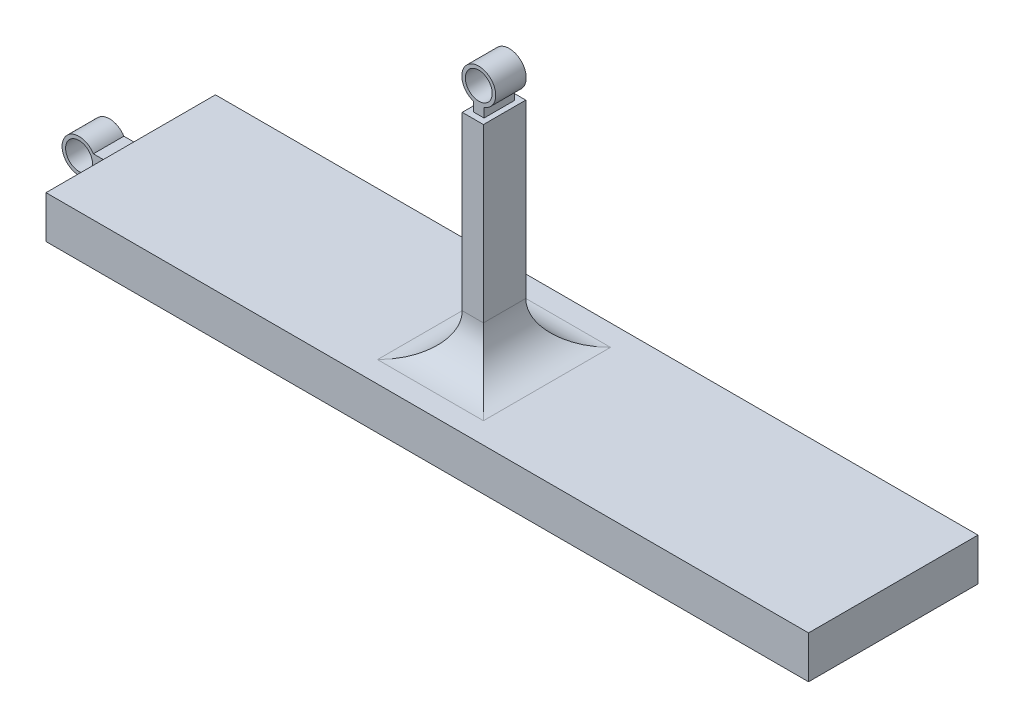
ISO-10303-21;
HEADER;
FILE_DESCRIPTION(('STEP AP214'),'2;1');
FILE_NAME('part.step','',(''),(''),'','','');
FILE_SCHEMA(('AUTOMOTIVE_DESIGN { 1 0 10303 214 1 1 1 1 }'));
ENDSEC;
DATA;
#1=APPLICATION_CONTEXT('core data for automotive mechanical design processes');
#2=APPLICATION_PROTOCOL_DEFINITION('international standard','automotive_design',2000,#1);
#3=PRODUCT_CONTEXT('',#1,'mechanical');
#4=PRODUCT('Part','Part','',(#3));
#5=PRODUCT_RELATED_PRODUCT_CATEGORY('part','',(#4));
#6=PRODUCT_DEFINITION_FORMATION('','',#4);
#7=PRODUCT_DEFINITION_CONTEXT('part definition',#1,'design');
#8=PRODUCT_DEFINITION('design','',#6,#7);
#9=PRODUCT_DEFINITION_SHAPE('','',#8);
#10=(LENGTH_UNIT() NAMED_UNIT(*) SI_UNIT(.MILLI.,.METRE.));
#11=(NAMED_UNIT(*) PLANE_ANGLE_UNIT() SI_UNIT($,.RADIAN.));
#12=(NAMED_UNIT(*) SI_UNIT($,.STERADIAN.) SOLID_ANGLE_UNIT());
#13=UNCERTAINTY_MEASURE_WITH_UNIT(LENGTH_MEASURE(1.E-05),#10,'distance_accuracy_value','');
#14=(GEOMETRIC_REPRESENTATION_CONTEXT(3) GLOBAL_UNCERTAINTY_ASSIGNED_CONTEXT((#13)) GLOBAL_UNIT_ASSIGNED_CONTEXT((#10,
#11,#12)) REPRESENTATION_CONTEXT('',''));
#15=CARTESIAN_POINT('',(0.,0.,0.));
#16=DIRECTION('',(0.,0.,1.));
#17=DIRECTION('',(1.,0.,0.));
#18=AXIS2_PLACEMENT_3D('',#15,#16,#17);
#19=CARTESIAN_POINT('',(361.815012660221,250.984199204464,125.));
#20=DIRECTION('',(0.,-1.,0.));
#21=DIRECTION('',(0.,0.,-1.));
#22=AXIS2_PLACEMENT_3D('',#19,#20,#21);
#23=PLANE('',#22);
#24=DIRECTION('',(-1.,0.,0.));
#25=VECTOR('',#24,1.);
#26=CARTESIAN_POINT('',(361.815012660221,250.984199204464,75.));
#27=LINE('',#26,#25);
#28=CARTESIAN_POINT('',(361.815012660221,250.984199204464,75.));
#29=VERTEX_POINT('',#28);
#30=CARTESIAN_POINT('',(336.815012660221,250.984199204464,75.));
#31=VERTEX_POINT('',#30);
#32=EDGE_CURVE('E209',#29,#31,#27,.T.);
#33=ORIENTED_EDGE('',*,*,#32,.T.);
#34=DIRECTION('',(0.,0.,-1.));
#35=VECTOR('',#34,1.);
#36=CARTESIAN_POINT('',(336.815012660221,250.984199204464,125.));
#37=LINE('',#36,#35);
#38=CARTESIAN_POINT('',(336.815012660221,250.984199204464,125.));
#39=VERTEX_POINT('',#38);
#40=EDGE_CURVE('E206',#39,#31,#37,.T.);
#41=ORIENTED_EDGE('',*,*,#40,.F.);
#42=DIRECTION('',(-1.,0.,0.));
#43=VECTOR('',#42,1.);
#44=CARTESIAN_POINT('',(361.815012660221,250.984199204464,125.));
#45=LINE('',#44,#43);
#46=CARTESIAN_POINT('',(361.815012660221,250.984199204464,125.));
#47=VERTEX_POINT('',#46);
#48=EDGE_CURVE('E200',#47,#39,#45,.T.);
#49=ORIENTED_EDGE('',*,*,#48,.F.);
#50=DIRECTION('',(0.,0.,-1.));
#51=VECTOR('',#50,1.);
#52=CARTESIAN_POINT('',(361.815012660221,250.984199204464,125.));
#53=LINE('',#52,#51);
#54=EDGE_CURVE('E215',#47,#29,#53,.T.);
#55=ORIENTED_EDGE('',*,*,#54,.T.);
#56=EDGE_LOOP('',(#33,#41,#49,#55));
#57=FACE_BOUND('',#56,.T.);
#58=DIRECTION('',(-1.,0.,0.));
#59=VECTOR('',#58,1.);
#60=CARTESIAN_POINT('',(0.,250.984199204464,82.));
#61=LINE('',#60,#59);
#62=CARTESIAN_POINT('',(355.564186933965,250.984199204464,82.));
#63=VERTEX_POINT('',#62);
#64=CARTESIAN_POINT('',(343.397322730233,250.984199204464,82.));
#65=VERTEX_POINT('',#64);
#66=EDGE_CURVE('E54',#63,#65,#61,.T.);
#67=ORIENTED_EDGE('',*,*,#66,.F.);
#68=DIRECTION('',(0.,0.,-1.));
#69=VECTOR('',#68,1.);
#70=CARTESIAN_POINT('',(355.564186933965,250.984199204464,118.));
#71=LINE('',#70,#69);
#72=CARTESIAN_POINT('',(355.564186933965,250.984199204464,118.));
#73=VERTEX_POINT('',#72);
#74=EDGE_CURVE('E616',#73,#63,#71,.T.);
#75=ORIENTED_EDGE('',*,*,#74,.F.);
#76=DIRECTION('',(-1.,0.,0.));
#77=VECTOR('',#76,1.);
#78=CARTESIAN_POINT('',(0.,250.984199204464,118.));
#79=LINE('',#78,#77);
#80=CARTESIAN_POINT('',(343.397322730233,250.984199204464,118.));
#81=VERTEX_POINT('',#80);
#82=EDGE_CURVE('E183',#73,#81,#79,.T.);
#83=ORIENTED_EDGE('',*,*,#82,.T.);
#84=DIRECTION('',(0.,0.,-1.));
#85=VECTOR('',#84,1.);
#86=CARTESIAN_POINT('',(343.397322730233,250.984199204464,118.));
#87=LINE('',#86,#85);
#88=EDGE_CURVE('E194',#81,#65,#87,.T.);
#89=ORIENTED_EDGE('',*,*,#88,.T.);
#90=EDGE_LOOP('',(#67,#75,#83,#89));
#91=FACE_BOUND('',#90,.T.);
#92=ADVANCED_FACE('F37',(#57,#91),#23,.F.);
#93=CARTESIAN_POINT('',(-79.4549873397789,-1.76580079553555,200.));
#94=DIRECTION('',(1.,0.,0.));
#95=DIRECTION('',(0.,0.,-1.));
#96=AXIS2_PLACEMENT_3D('',#93,#94,#95);
#97=PLANE('',#96);
#98=DIRECTION('',(0.,0.,-1.));
#99=VECTOR('',#98,1.);
#100=CARTESIAN_POINT('',(-79.4549873397789,-39.5392903074215,118.));
#101=LINE('',#100,#99);
#102=CARTESIAN_POINT('',(-79.4549873397789,-39.5392903074215,118.));
#103=VERTEX_POINT('',#102);
#104=CARTESIAN_POINT('',(-79.4549873397789,-39.5392903074215,82.));
#105=VERTEX_POINT('',#104);
#106=EDGE_CURVE('E247',#103,#105,#101,.T.);
#107=ORIENTED_EDGE('',*,*,#106,.T.);
#108=DIRECTION('',(0.,1.,0.));
#109=VECTOR('',#108,1.);
#110=CARTESIAN_POINT('',(-79.4549873397789,0.,82.));
#111=LINE('',#110,#109);
#112=CARTESIAN_POINT('',(-79.4549873397789,-16.1050713336061,82.));
#113=VERTEX_POINT('',#112);
#114=EDGE_CURVE('E242',#105,#113,#111,.T.);
#115=ORIENTED_EDGE('',*,*,#114,.T.);
#116=DIRECTION('',(0.,0.,-1.));
#117=VECTOR('',#116,1.);
#118=CARTESIAN_POINT('',(-79.4549873397789,-16.1050713336061,118.));
#119=LINE('',#118,#117);
#120=CARTESIAN_POINT('',(-79.4549873397789,-16.1050713336061,118.));
#121=VERTEX_POINT('',#120);
#122=EDGE_CURVE('E251',#121,#113,#119,.T.);
#123=ORIENTED_EDGE('',*,*,#122,.F.);
#124=DIRECTION('',(0.,1.,0.));
#125=VECTOR('',#124,1.);
#126=CARTESIAN_POINT('',(-79.4549873397789,0.,118.));
#127=LINE('',#126,#125);
#128=EDGE_CURVE('E228',#103,#121,#127,.T.);
#129=ORIENTED_EDGE('',*,*,#128,.F.);
#130=EDGE_LOOP('',(#107,#115,#123,#129));
#131=FACE_BOUND('',#130,.T.);
#132=DIRECTION('',(0.,-1.,0.));
#133=VECTOR('',#132,1.);
#134=CARTESIAN_POINT('',(-79.4549873397789,-1.76580079553555,0.));
#135=LINE('',#134,#133);
#136=CARTESIAN_POINT('',(-79.4549873397789,-1.76580079553555,0.));
#137=VERTEX_POINT('',#136);
#138=CARTESIAN_POINT('',(-79.4549873397789,-51.7658007955356,0.));
#139=VERTEX_POINT('',#138);
#140=EDGE_CURVE('E250',#137,#139,#135,.T.);
#141=ORIENTED_EDGE('',*,*,#140,.T.);
#142=DIRECTION('',(0.,0.,-1.));
#143=VECTOR('',#142,1.);
#144=CARTESIAN_POINT('',(-79.4549873397789,-51.7658007955356,200.));
#145=LINE('',#144,#143);
#146=CARTESIAN_POINT('',(-79.4549873397789,-51.7658007955356,200.));
#147=VERTEX_POINT('',#146);
#148=EDGE_CURVE('E282',#147,#139,#145,.T.);
#149=ORIENTED_EDGE('',*,*,#148,.F.);
#150=DIRECTION('',(0.,-1.,0.));
#151=VECTOR('',#150,1.);
#152=CARTESIAN_POINT('',(-79.4549873397789,-1.76580079553555,200.));
#153=LINE('',#152,#151);
#154=CARTESIAN_POINT('',(-79.4549873397789,-1.76580079553555,200.));
#155=VERTEX_POINT('',#154);
#156=EDGE_CURVE('E256',#155,#147,#153,.T.);
#157=ORIENTED_EDGE('',*,*,#156,.F.);
#158=DIRECTION('',(0.,0.,-1.));
#159=VECTOR('',#158,1.);
#160=CARTESIAN_POINT('',(-79.4549873397789,-1.76580079553555,200.));
#161=LINE('',#160,#159);
#162=EDGE_CURVE('E266',#155,#137,#161,.T.);
#163=ORIENTED_EDGE('',*,*,#162,.T.);
#164=EDGE_LOOP('',(#141,#149,#157,#163));
#165=FACE_BOUND('',#164,.T.);
#166=ADVANCED_FACE('F345',(#131,#165),#97,.F.);
#167=CARTESIAN_POINT('',(-79.4549873397789,-51.7658007955356,200.));
#168=DIRECTION('',(0.,1.,0.));
#169=DIRECTION('',(0.,0.,1.));
#170=AXIS2_PLACEMENT_3D('',#167,#168,#169);
#171=PLANE('',#170);
#172=DIRECTION('',(1.,0.,0.));
#173=VECTOR('',#172,1.);
#174=CARTESIAN_POINT('',(-79.4549873397789,-51.7658007955356,0.));
#175=LINE('',#174,#173);
#176=CARTESIAN_POINT('',(820.545012660221,-51.7658007955356,0.));
#177=VERTEX_POINT('',#176);
#178=EDGE_CURVE('E269',#139,#177,#175,.T.);
#179=ORIENTED_EDGE('',*,*,#178,.T.);
#180=DIRECTION('',(0.,0.,-1.));
#181=VECTOR('',#180,1.);
#182=CARTESIAN_POINT('',(820.545012660221,-51.7658007955356,200.));
#183=LINE('',#182,#181);
#184=CARTESIAN_POINT('',(820.545012660221,-51.7658007955356,200.));
#185=VERTEX_POINT('',#184);
#186=EDGE_CURVE('E279',#185,#177,#183,.T.);
#187=ORIENTED_EDGE('',*,*,#186,.F.);
#188=DIRECTION('',(1.,0.,0.));
#189=VECTOR('',#188,1.);
#190=CARTESIAN_POINT('',(-79.4549873397789,-51.7658007955356,200.));
#191=LINE('',#190,#189);
#192=EDGE_CURVE('E259',#147,#185,#191,.T.);
#193=ORIENTED_EDGE('',*,*,#192,.F.);
#194=ORIENTED_EDGE('',*,*,#148,.T.);
#195=EDGE_LOOP('',(#179,#187,#193,#194));
#196=FACE_BOUND('',#195,.T.);
#197=ADVANCED_FACE('F350',(#196),#171,.F.);
#198=CARTESIAN_POINT('',(820.545012660221,-51.7658007955356,200.));
#199=DIRECTION('',(-1.,0.,0.));
#200=DIRECTION('',(0.,0.,1.));
#201=AXIS2_PLACEMENT_3D('',#198,#199,#200);
#202=PLANE('',#201);
#203=DIRECTION('',(0.,1.,0.));
#204=VECTOR('',#203,1.);
#205=CARTESIAN_POINT('',(820.545012660221,-51.7658007955356,0.));
#206=LINE('',#205,#204);
#207=CARTESIAN_POINT('',(820.545012660221,-1.76580079553555,0.));
#208=VERTEX_POINT('',#207);
#209=EDGE_CURVE('E271',#177,#208,#206,.T.);
#210=ORIENTED_EDGE('',*,*,#209,.T.);
#211=DIRECTION('',(0.,0.,-1.));
#212=VECTOR('',#211,1.);
#213=CARTESIAN_POINT('',(820.545012660221,-1.76580079553555,200.));
#214=LINE('',#213,#212);
#215=CARTESIAN_POINT('',(820.545012660221,-1.76580079553555,200.));
#216=VERTEX_POINT('',#215);
#217=EDGE_CURVE('E276',#216,#208,#214,.T.);
#218=ORIENTED_EDGE('',*,*,#217,.F.);
#219=DIRECTION('',(0.,1.,0.));
#220=VECTOR('',#219,1.);
#221=CARTESIAN_POINT('',(820.545012660221,-51.7658007955356,200.));
#222=LINE('',#221,#220);
#223=EDGE_CURVE('E262',#185,#216,#222,.T.);
#224=ORIENTED_EDGE('',*,*,#223,.F.);
#225=ORIENTED_EDGE('',*,*,#186,.T.);
#226=EDGE_LOOP('',(#210,#218,#224,#225));
#227=FACE_BOUND('',#226,.T.);
#228=ADVANCED_FACE('F334',(#227),#202,.F.);
#229=CARTESIAN_POINT('',(-79.4549873397789,-1.76580079553555,200.));
#230=DIRECTION('',(0.,-1.,0.));
#231=DIRECTION('',(0.,0.,-1.));
#232=AXIS2_PLACEMENT_3D('',#229,#230,#231);
#233=PLANE('',#232);
#234=DIRECTION('',(1.,0.,0.));
#235=VECTOR('',#234,1.);
#236=CARTESIAN_POINT('',(-79.4549873397789,-1.76580079553555,175.));
#237=LINE('',#236,#235);
#238=CARTESIAN_POINT('',(411.815012660221,-1.76580079553555,175.));
#239=VERTEX_POINT('',#238);
#240=CARTESIAN_POINT('',(286.815012660221,-1.76580079553555,175.));
#241=VERTEX_POINT('',#240);
#242=EDGE_CURVE('E289',#239,#241,#237,.F.);
#243=ORIENTED_EDGE('',*,*,#242,.T.);
#244=DIRECTION('',(0.,0.,-1.));
#245=VECTOR('',#244,1.);
#246=CARTESIAN_POINT('',(286.815012660221,-1.76580079553555,75.));
#247=LINE('',#246,#245);
#248=CARTESIAN_POINT('',(286.815012660221,-1.76580079553555,25.));
#249=VERTEX_POINT('',#248);
#250=EDGE_CURVE('E291',#241,#249,#247,.T.);
#251=ORIENTED_EDGE('',*,*,#250,.T.);
#252=DIRECTION('',(1.,0.,0.));
#253=VECTOR('',#252,1.);
#254=CARTESIAN_POINT('',(361.815012660221,-1.76580079553555,25.));
#255=LINE('',#254,#253);
#256=CARTESIAN_POINT('',(411.815012660221,-1.76580079553555,25.));
#257=VERTEX_POINT('',#256);
#258=EDGE_CURVE('E285',#249,#257,#255,.T.);
#259=ORIENTED_EDGE('',*,*,#258,.T.);
#260=DIRECTION('',(0.,0.,-1.));
#261=VECTOR('',#260,1.);
#262=CARTESIAN_POINT('',(411.815012660221,-1.76580079553555,125.));
#263=LINE('',#262,#261);
#264=EDGE_CURVE('E287',#257,#239,#263,.F.);
#265=ORIENTED_EDGE('',*,*,#264,.T.);
#266=EDGE_LOOP('',(#243,#251,#259,#265));
#267=FACE_BOUND('',#266,.T.);
#268=DIRECTION('',(-1.,0.,0.));
#269=VECTOR('',#268,1.);
#270=CARTESIAN_POINT('',(-79.4549873397789,-1.76580079553555,0.));
#271=LINE('',#270,#269);
#272=EDGE_CURVE('E260',#208,#137,#271,.T.);
#273=ORIENTED_EDGE('',*,*,#272,.T.);
#274=ORIENTED_EDGE('',*,*,#162,.F.);
#275=DIRECTION('',(-1.,0.,0.));
#276=VECTOR('',#275,1.);
#277=CARTESIAN_POINT('',(-79.4549873397789,-1.76580079553555,200.));
#278=LINE('',#277,#276);
#279=EDGE_CURVE('E264',#216,#155,#278,.T.);
#280=ORIENTED_EDGE('',*,*,#279,.F.);
#281=ORIENTED_EDGE('',*,*,#217,.T.);
#282=EDGE_LOOP('',(#273,#274,#280,#281));
#283=FACE_BOUND('',#282,.T.);
#284=ADVANCED_FACE('F330',(#267,#283),#233,.F.);
#285=CARTESIAN_POINT('',(0.,0.,200.));
#286=DIRECTION('',(0.,0.,1.));
#287=DIRECTION('',(1.,0.,0.));
#288=AXIS2_PLACEMENT_3D('',#285,#286,#287);
#289=PLANE('',#288);
#290=ORIENTED_EDGE('',*,*,#156,.T.);
#291=ORIENTED_EDGE('',*,*,#192,.T.);
#292=ORIENTED_EDGE('',*,*,#223,.T.);
#293=ORIENTED_EDGE('',*,*,#279,.T.);
#294=EDGE_LOOP('',(#290,#291,#292,#293));
#295=FACE_BOUND('',#294,.T.);
#296=ADVANCED_FACE('F333',(#295),#289,.T.);
#297=CARTESIAN_POINT('',(0.,0.,0.));
#298=DIRECTION('',(0.,0.,1.));
#299=DIRECTION('',(1.,0.,0.));
#300=AXIS2_PLACEMENT_3D('',#297,#298,#299);
#301=PLANE('',#300);
#302=ORIENTED_EDGE('',*,*,#140,.F.);
#303=ORIENTED_EDGE('',*,*,#272,.F.);
#304=ORIENTED_EDGE('',*,*,#209,.F.);
#305=ORIENTED_EDGE('',*,*,#178,.F.);
#306=EDGE_LOOP('',(#302,#303,#304,#305));
#307=FACE_BOUND('',#306,.T.);
#308=ADVANCED_FACE('F347',(#307),#301,.F.);
#309=CARTESIAN_POINT('',(0.,-39.5392903074215,118.));
#310=DIRECTION('',(0.,-1.,0.));
#311=DIRECTION('',(0.,0.,-1.));
#312=AXIS2_PLACEMENT_3D('',#309,#310,#311);
#313=PLANE('',#312);
#314=DIRECTION('',(-1.,0.,0.));
#315=VECTOR('',#314,1.);
#316=CARTESIAN_POINT('',(0.,-39.5392903074215,82.));
#317=LINE('',#316,#315);
#318=CARTESIAN_POINT('',(-107.065446550992,-39.5392903074215,82.));
#319=VERTEX_POINT('',#318);
#320=EDGE_CURVE('E218',#105,#319,#317,.T.);
#321=ORIENTED_EDGE('',*,*,#320,.F.);
#322=ORIENTED_EDGE('',*,*,#106,.F.);
#323=DIRECTION('',(-1.,0.,0.));
#324=VECTOR('',#323,1.);
#325=CARTESIAN_POINT('',(0.,-39.5392903074215,118.));
#326=LINE('',#325,#324);
#327=CARTESIAN_POINT('',(-107.065446550992,-39.5392903074215,118.));
#328=VERTEX_POINT('',#327);
#329=EDGE_CURVE('E219',#103,#328,#326,.T.);
#330=ORIENTED_EDGE('',*,*,#329,.T.);
#331=DIRECTION('',(0.,0.,-1.));
#332=VECTOR('',#331,1.);
#333=CARTESIAN_POINT('',(-107.065446550992,-39.5392903074215,118.));
#334=LINE('',#333,#332);
#335=EDGE_CURVE('E233',#328,#319,#334,.T.);
#336=ORIENTED_EDGE('',*,*,#335,.T.);
#337=EDGE_LOOP('',(#321,#322,#330,#336));
#338=FACE_BOUND('',#337,.T.);
#339=ADVANCED_FACE('F391',(#338),#313,.T.);
#340=CARTESIAN_POINT('',(0.,-16.1050713336061,118.));
#341=DIRECTION('',(0.,-1.,0.));
#342=DIRECTION('',(0.,0.,-1.));
#343=AXIS2_PLACEMENT_3D('',#340,#341,#342);
#344=PLANE('',#343);
#345=DIRECTION('',(-1.,0.,0.));
#346=VECTOR('',#345,1.);
#347=CARTESIAN_POINT('',(0.,-16.1050713336061,82.));
#348=LINE('',#347,#346);
#349=CARTESIAN_POINT('',(-105.533142069846,-16.1050713336061,82.));
#350=VERTEX_POINT('',#349);
#351=EDGE_CURVE('E239',#113,#350,#348,.T.);
#352=ORIENTED_EDGE('',*,*,#351,.T.);
#353=DIRECTION('',(0.,0.,-1.));
#354=VECTOR('',#353,1.);
#355=CARTESIAN_POINT('',(-105.533142069846,-16.1050713336061,118.));
#356=LINE('',#355,#354);
#357=CARTESIAN_POINT('',(-105.533142069846,-16.1050713336061,118.));
#358=VERTEX_POINT('',#357);
#359=EDGE_CURVE('E253',#358,#350,#356,.T.);
#360=ORIENTED_EDGE('',*,*,#359,.F.);
#361=DIRECTION('',(-1.,0.,0.));
#362=VECTOR('',#361,1.);
#363=CARTESIAN_POINT('',(0.,-16.1050713336061,118.));
#364=LINE('',#363,#362);
#365=EDGE_CURVE('E226',#121,#358,#364,.T.);
#366=ORIENTED_EDGE('',*,*,#365,.F.);
#367=ORIENTED_EDGE('',*,*,#122,.T.);
#368=EDGE_LOOP('',(#352,#360,#366,#367));
#369=FACE_BOUND('',#368,.T.);
#370=ADVANCED_FACE('F388',(#369),#344,.F.);
#371=CARTESIAN_POINT('',(-122.454987339779,-26.7658007955356,118.));
#372=DIRECTION('',(0.,0.,-1.));
#373=DIRECTION('',(-1.,0.,0.));
#374=AXIS2_PLACEMENT_3D('',#371,#372,#373);
#375=CYLINDRICAL_SURFACE('',#374,20.);
#376=CARTESIAN_POINT('',(-122.454987339779,-26.7658007955356,82.));
#377=DIRECTION('',(0.,0.,-1.));
#378=DIRECTION('',(-1.,0.,0.));
#379=AXIS2_PLACEMENT_3D('',#376,#377,#378);
#380=CIRCLE('',#379,20.);
#381=EDGE_CURVE('E236',#319,#350,#380,.T.);
#382=ORIENTED_EDGE('',*,*,#381,.F.);
#383=ORIENTED_EDGE('',*,*,#335,.F.);
#384=CARTESIAN_POINT('',(-122.454987339779,-26.7658007955356,118.));
#385=DIRECTION('',(0.,0.,-1.));
#386=DIRECTION('',(-1.,0.,0.));
#387=AXIS2_PLACEMENT_3D('',#384,#385,#386);
#388=CIRCLE('',#387,20.);
#389=EDGE_CURVE('E222',#328,#358,#388,.T.);
#390=ORIENTED_EDGE('',*,*,#389,.T.);
#391=ORIENTED_EDGE('',*,*,#359,.T.);
#392=EDGE_LOOP('',(#382,#383,#390,#391));
#393=FACE_BOUND('',#392,.T.);
#394=ADVANCED_FACE('F386',(#393),#375,.T.);
#395=CARTESIAN_POINT('',(-122.454987339779,-26.7658007955356,118.));
#396=DIRECTION('',(0.,0.,-1.));
#397=DIRECTION('',(-1.,0.,0.));
#398=AXIS2_PLACEMENT_3D('',#395,#396,#397);
#399=CYLINDRICAL_SURFACE('',#398,15.875);
#400=CARTESIAN_POINT('',(-122.454987339779,-26.7658007955356,118.));
#401=DIRECTION('',(0.,0.,-1.));
#402=DIRECTION('',(-1.,0.,0.));
#403=AXIS2_PLACEMENT_3D('',#400,#401,#402);
#404=CIRCLE('',#403,15.875);
#405=CARTESIAN_POINT('',(-138.329987339779,-26.7658007955356,118.));
#406=VERTEX_POINT('',#405);
#407=EDGE_CURVE('E230',#406,#406,#404,.T.);
#408=ORIENTED_EDGE('',*,*,#407,.F.);
#409=EDGE_LOOP('',(#408));
#410=FACE_BOUND('',#409,.T.);
#411=CARTESIAN_POINT('',(-122.454987339779,-26.7658007955356,82.));
#412=DIRECTION('',(0.,0.,-1.));
#413=DIRECTION('',(-1.,0.,0.));
#414=AXIS2_PLACEMENT_3D('',#411,#412,#413);
#415=CIRCLE('',#414,15.875);
#416=CARTESIAN_POINT('',(-138.329987339779,-26.7658007955356,82.));
#417=VERTEX_POINT('',#416);
#418=EDGE_CURVE('E223',#417,#417,#415,.T.);
#419=ORIENTED_EDGE('',*,*,#418,.T.);
#420=EDGE_LOOP('',(#419));
#421=FACE_BOUND('',#420,.T.);
#422=ADVANCED_FACE('F379',(#410,#421),#399,.F.);
#423=CARTESIAN_POINT('',(0.,0.,118.));
#424=DIRECTION('',(0.,0.,-1.));
#425=DIRECTION('',(-1.,0.,0.));
#426=AXIS2_PLACEMENT_3D('',#423,#424,#425);
#427=PLANE('',#426);
#428=ORIENTED_EDGE('',*,*,#329,.F.);
#429=ORIENTED_EDGE('',*,*,#128,.T.);
#430=ORIENTED_EDGE('',*,*,#365,.T.);
#431=ORIENTED_EDGE('',*,*,#389,.F.);
#432=EDGE_LOOP('',(#428,#429,#430,#431));
#433=FACE_BOUND('',#432,.T.);
#434=ORIENTED_EDGE('',*,*,#407,.T.);
#435=EDGE_LOOP('',(#434));
#436=FACE_BOUND('',#435,.T.);
#437=ADVANCED_FACE('F376',(#433,#436),#427,.F.);
#438=CARTESIAN_POINT('',(0.,0.,82.));
#439=DIRECTION('',(0.,0.,-1.));
#440=DIRECTION('',(-1.,0.,0.));
#441=AXIS2_PLACEMENT_3D('',#438,#439,#440);
#442=PLANE('',#441);
#443=ORIENTED_EDGE('',*,*,#320,.T.);
#444=ORIENTED_EDGE('',*,*,#381,.T.);
#445=ORIENTED_EDGE('',*,*,#351,.F.);
#446=ORIENTED_EDGE('',*,*,#114,.F.);
#447=EDGE_LOOP('',(#443,#444,#445,#446));
#448=FACE_BOUND('',#447,.T.);
#449=ORIENTED_EDGE('',*,*,#418,.F.);
#450=EDGE_LOOP('',(#449));
#451=FACE_BOUND('',#450,.T.);
#452=ADVANCED_FACE('F375',(#448,#451),#442,.T.);
#453=CARTESIAN_POINT('',(361.815012660221,-1.76580079553555,125.));
#454=DIRECTION('',(-1.,0.,0.));
#455=DIRECTION('',(0.,0.,1.));
#456=AXIS2_PLACEMENT_3D('',#453,#454,#455);
#457=PLANE('',#456);
#458=DIRECTION('',(0.,1.,0.));
#459=VECTOR('',#458,1.);
#460=CARTESIAN_POINT('',(361.815012660221,-1.76580079553555,125.));
#461=LINE('',#460,#459);
#462=CARTESIAN_POINT('',(361.815012660221,48.2341992044645,125.));
#463=VERTEX_POINT('',#462);
#464=EDGE_CURVE('E198',#463,#47,#461,.T.);
#465=ORIENTED_EDGE('',*,*,#464,.F.);
#466=DIRECTION('',(0.,0.,-1.));
#467=VECTOR('',#466,1.);
#468=CARTESIAN_POINT('',(361.815012660221,48.2341992044645,75.));
#469=LINE('',#468,#467);
#470=CARTESIAN_POINT('',(361.815012660221,48.2341992044645,75.));
#471=VERTEX_POINT('',#470);
#472=EDGE_CURVE('E46',#463,#471,#469,.T.);
#473=ORIENTED_EDGE('',*,*,#472,.T.);
#474=DIRECTION('',(0.,1.,0.));
#475=VECTOR('',#474,1.);
#476=CARTESIAN_POINT('',(361.815012660221,-1.76580079553555,75.));
#477=LINE('',#476,#475);
#478=EDGE_CURVE('E207',#471,#29,#477,.T.);
#479=ORIENTED_EDGE('',*,*,#478,.T.);
#480=ORIENTED_EDGE('',*,*,#54,.F.);
#481=EDGE_LOOP('',(#465,#473,#479,#480));
#482=FACE_BOUND('',#481,.T.);
#483=ADVANCED_FACE('F372',(#482),#457,.F.);
#484=CARTESIAN_POINT('',(336.815012660221,-1.76580079553555,125.));
#485=DIRECTION('',(1.,0.,0.));
#486=DIRECTION('',(0.,1.,0.));
#487=AXIS2_PLACEMENT_3D('',#484,#485,#486);
#488=PLANE('',#487);
#489=DIRECTION('',(0.,-1.,0.));
#490=VECTOR('',#489,1.);
#491=CARTESIAN_POINT('',(336.815012660221,-1.76580079553555,75.));
#492=LINE('',#491,#490);
#493=CARTESIAN_POINT('',(336.815012660221,48.2341992044645,75.));
#494=VERTEX_POINT('',#493);
#495=EDGE_CURVE('E201',#31,#494,#492,.T.);
#496=ORIENTED_EDGE('',*,*,#495,.T.);
#497=DIRECTION('',(0.,0.,-1.));
#498=VECTOR('',#497,1.);
#499=CARTESIAN_POINT('',(336.815012660221,48.2341992044644,125.));
#500=LINE('',#499,#498);
#501=CARTESIAN_POINT('',(336.815012660221,48.2341992044645,125.));
#502=VERTEX_POINT('',#501);
#503=EDGE_CURVE('E294',#494,#502,#500,.F.);
#504=ORIENTED_EDGE('',*,*,#503,.T.);
#505=DIRECTION('',(0.,-1.,0.));
#506=VECTOR('',#505,1.);
#507=CARTESIAN_POINT('',(336.815012660221,-1.76580079553555,125.));
#508=LINE('',#507,#506);
#509=EDGE_CURVE('E203',#39,#502,#508,.T.);
#510=ORIENTED_EDGE('',*,*,#509,.F.);
#511=ORIENTED_EDGE('',*,*,#40,.T.);
#512=EDGE_LOOP('',(#496,#504,#510,#511));
#513=FACE_BOUND('',#512,.T.);
#514=ADVANCED_FACE('F323',(#513),#488,.F.);
#515=CARTESIAN_POINT('',(0.,0.,125.));
#516=DIRECTION('',(0.,0.,1.));
#517=DIRECTION('',(1.,0.,0.));
#518=AXIS2_PLACEMENT_3D('',#515,#516,#517);
#519=PLANE('',#518);
#520=ORIENTED_EDGE('',*,*,#509,.T.);
#521=DIRECTION('',(1.,0.,0.));
#522=VECTOR('',#521,1.);
#523=CARTESIAN_POINT('',(0.,48.2341992044645,125.));
#524=LINE('',#523,#522);
#525=EDGE_CURVE('E297',#502,#463,#524,.T.);
#526=ORIENTED_EDGE('',*,*,#525,.T.);
#527=ORIENTED_EDGE('',*,*,#464,.T.);
#528=ORIENTED_EDGE('',*,*,#48,.T.);
#529=EDGE_LOOP('',(#520,#526,#527,#528));
#530=FACE_BOUND('',#529,.T.);
#531=ADVANCED_FACE('F442',(#530),#519,.T.);
#532=CARTESIAN_POINT('',(0.,0.,75.));
#533=DIRECTION('',(0.,0.,1.));
#534=DIRECTION('',(1.,0.,0.));
#535=AXIS2_PLACEMENT_3D('',#532,#533,#534);
#536=PLANE('',#535);
#537=ORIENTED_EDGE('',*,*,#478,.F.);
#538=DIRECTION('',(1.,0.,0.));
#539=VECTOR('',#538,1.);
#540=CARTESIAN_POINT('',(336.815012660221,48.2341992044645,75.));
#541=LINE('',#540,#539);
#542=EDGE_CURVE('E11',#471,#494,#541,.F.);
#543=ORIENTED_EDGE('',*,*,#542,.T.);
#544=ORIENTED_EDGE('',*,*,#495,.F.);
#545=ORIENTED_EDGE('',*,*,#32,.F.);
#546=EDGE_LOOP('',(#537,#543,#544,#545));
#547=FACE_BOUND('',#546,.T.);
#548=ADVANCED_FACE('F319',(#547),#536,.F.);
#549=CARTESIAN_POINT('',(411.815012660221,48.2341992044645,125.));
#550=DIRECTION('',(0.,0.,1.));
#551=DIRECTION('',(1.,0.,0.));
#552=AXIS2_PLACEMENT_3D('',#549,#550,#551);
#553=CYLINDRICAL_SURFACE('',#552,50.);
#554=CARTESIAN_POINT('',(411.815012660221,48.2341992044645,25.));
#555=DIRECTION('',(-0.707106781186547,0.,-0.707106781186547));
#556=DIRECTION('',(-0.707106781186547,0.,0.707106781186547));
#557=AXIS2_PLACEMENT_3D('',#554,#555,#556);
#558=ELLIPSE('',#557,70.7106781186548,50.);
#559=EDGE_CURVE('E300',#471,#257,#558,.F.);
#560=ORIENTED_EDGE('',*,*,#559,.F.);
#561=ORIENTED_EDGE('',*,*,#472,.F.);
#562=CARTESIAN_POINT('',(411.815012660221,48.2341992044645,175.));
#563=DIRECTION('',(-0.707106781186547,0.,0.707106781186547));
#564=DIRECTION('',(0.707106781186547,0.,0.707106781186547));
#565=AXIS2_PLACEMENT_3D('',#562,#563,#564);
#566=ELLIPSE('',#565,70.7106781186548,50.);
#567=EDGE_CURVE('E41',#239,#463,#566,.F.);
#568=ORIENTED_EDGE('',*,*,#567,.F.);
#569=ORIENTED_EDGE('',*,*,#264,.F.);
#570=EDGE_LOOP('',(#560,#561,#568,#569));
#571=FACE_BOUND('',#570,.T.);
#572=ADVANCED_FACE('F39',(#571),#553,.F.);
#573=CARTESIAN_POINT('',(0.,48.2341992044645,175.));
#574=DIRECTION('',(1.,0.,0.));
#575=DIRECTION('',(0.,0.,-1.));
#576=AXIS2_PLACEMENT_3D('',#573,#574,#575);
#577=CYLINDRICAL_SURFACE('',#576,50.);
#578=ORIENTED_EDGE('',*,*,#567,.T.);
#579=ORIENTED_EDGE('',*,*,#525,.F.);
#580=CARTESIAN_POINT('',(286.815012660221,48.2341992044645,175.));
#581=DIRECTION('',(0.707106781186547,0.,0.707106781186547));
#582=DIRECTION('',(0.707106781186547,0.,-0.707106781186547));
#583=AXIS2_PLACEMENT_3D('',#580,#581,#582);
#584=ELLIPSE('',#583,70.7106781186548,50.);
#585=EDGE_CURVE('E192',#241,#502,#584,.T.);
#586=ORIENTED_EDGE('',*,*,#585,.F.);
#587=ORIENTED_EDGE('',*,*,#242,.F.);
#588=EDGE_LOOP('',(#578,#579,#586,#587));
#589=FACE_BOUND('',#588,.T.);
#590=ADVANCED_FACE('F311',(#589),#577,.F.);
#591=CARTESIAN_POINT('',(-79.4549873397789,48.2341992044645,25.));
#592=DIRECTION('',(-1.,0.,0.));
#593=DIRECTION('',(0.,0.,1.));
#594=AXIS2_PLACEMENT_3D('',#591,#592,#593);
#595=CYLINDRICAL_SURFACE('',#594,50.);
#596=ORIENTED_EDGE('',*,*,#559,.T.);
#597=ORIENTED_EDGE('',*,*,#258,.F.);
#598=CARTESIAN_POINT('',(286.815012660221,48.2341992044645,25.));
#599=DIRECTION('',(-0.707106781186547,0.,0.707106781186547));
#600=DIRECTION('',(-0.707106781186547,0.,-0.707106781186547));
#601=AXIS2_PLACEMENT_3D('',#598,#599,#600);
#602=ELLIPSE('',#601,70.7106781186548,50.);
#603=EDGE_CURVE('E190',#494,#249,#602,.F.);
#604=ORIENTED_EDGE('',*,*,#603,.F.);
#605=ORIENTED_EDGE('',*,*,#542,.F.);
#606=EDGE_LOOP('',(#596,#597,#604,#605));
#607=FACE_BOUND('',#606,.T.);
#608=ADVANCED_FACE('F316',(#607),#595,.F.);
#609=CARTESIAN_POINT('',(286.815012660221,48.2341992044645,200.));
#610=DIRECTION('',(0.,0.,1.));
#611=DIRECTION('',(1.,0.,0.));
#612=AXIS2_PLACEMENT_3D('',#609,#610,#611);
#613=CYLINDRICAL_SURFACE('',#612,50.);
#614=ORIENTED_EDGE('',*,*,#585,.T.);
#615=ORIENTED_EDGE('',*,*,#503,.F.);
#616=ORIENTED_EDGE('',*,*,#603,.T.);
#617=ORIENTED_EDGE('',*,*,#250,.F.);
#618=EDGE_LOOP('',(#614,#615,#616,#617));
#619=FACE_BOUND('',#618,.T.);
#620=ADVANCED_FACE('F327',(#619),#613,.F.);
#621=CARTESIAN_POINT('',(355.564186933965,0.,118.));
#622=DIRECTION('',(-1.,0.,0.));
#623=DIRECTION('',(0.,0.,1.));
#624=AXIS2_PLACEMENT_3D('',#621,#622,#623);
#625=PLANE('',#624);
#626=DIRECTION('',(0.,1.,0.));
#627=VECTOR('',#626,1.);
#628=CARTESIAN_POINT('',(355.564186933965,0.,82.));
#629=LINE('',#628,#627);
#630=CARTESIAN_POINT('',(355.564186933965,261.985572388392,82.));
#631=VERTEX_POINT('',#630);
#632=EDGE_CURVE('E189',#63,#631,#629,.T.);
#633=ORIENTED_EDGE('',*,*,#632,.T.);
#634=DIRECTION('',(0.,0.,-1.));
#635=VECTOR('',#634,1.);
#636=CARTESIAN_POINT('',(355.564186933965,261.985572388392,118.));
#637=LINE('',#636,#635);
#638=CARTESIAN_POINT('',(355.564186933965,261.985572388392,118.));
#639=VERTEX_POINT('',#638);
#640=EDGE_CURVE('E170',#639,#631,#637,.T.);
#641=ORIENTED_EDGE('',*,*,#640,.F.);
#642=DIRECTION('',(0.,1.,0.));
#643=VECTOR('',#642,1.);
#644=CARTESIAN_POINT('',(355.564186933965,0.,118.));
#645=LINE('',#644,#643);
#646=EDGE_CURVE('E177',#73,#639,#645,.T.);
#647=ORIENTED_EDGE('',*,*,#646,.F.);
#648=ORIENTED_EDGE('',*,*,#74,.T.);
#649=EDGE_LOOP('',(#633,#641,#647,#648));
#650=FACE_BOUND('',#649,.T.);
#651=ADVANCED_FACE('F188',(#650),#625,.F.);
#652=CARTESIAN_POINT('',(349.315012660221,280.984199204464,118.));
#653=DIRECTION('',(0.,0.,-1.));
#654=DIRECTION('',(-1.,0.,0.));
#655=AXIS2_PLACEMENT_3D('',#652,#653,#654);
#656=CYLINDRICAL_SURFACE('',#655,20.);
#657=CARTESIAN_POINT('',(349.315012660221,280.984199204464,82.));
#658=DIRECTION('',(0.,0.,1.));
#659=DIRECTION('',(1.,0.,0.));
#660=AXIS2_PLACEMENT_3D('',#657,#658,#659);
#661=CIRCLE('',#660,20.);
#662=CARTESIAN_POINT('',(343.397322730233,261.879724705214,82.));
#663=VERTEX_POINT('',#662);
#664=EDGE_CURVE('E625',#631,#663,#661,.T.);
#665=ORIENTED_EDGE('',*,*,#664,.T.);
#666=DIRECTION('',(0.,0.,-1.));
#667=VECTOR('',#666,1.);
#668=CARTESIAN_POINT('',(343.397322730233,261.879724705214,118.));
#669=LINE('',#668,#667);
#670=CARTESIAN_POINT('',(343.397322730233,261.879724705214,118.));
#671=VERTEX_POINT('',#670);
#672=EDGE_CURVE('E172',#671,#663,#669,.T.);
#673=ORIENTED_EDGE('',*,*,#672,.F.);
#674=CARTESIAN_POINT('',(349.315012660221,280.984199204464,118.));
#675=DIRECTION('',(0.,0.,1.));
#676=DIRECTION('',(1.,0.,0.));
#677=AXIS2_PLACEMENT_3D('',#674,#675,#676);
#678=CIRCLE('',#677,20.);
#679=EDGE_CURVE('E165',#639,#671,#678,.T.);
#680=ORIENTED_EDGE('',*,*,#679,.F.);
#681=ORIENTED_EDGE('',*,*,#640,.T.);
#682=EDGE_LOOP('',(#665,#673,#680,#681));
#683=FACE_BOUND('',#682,.T.);
#684=ADVANCED_FACE('F168',(#683),#656,.T.);
#685=CARTESIAN_POINT('',(343.397322730233,0.,118.));
#686=DIRECTION('',(-1.,0.,0.));
#687=DIRECTION('',(0.,0.,1.));
#688=AXIS2_PLACEMENT_3D('',#685,#686,#687);
#689=PLANE('',#688);
#690=DIRECTION('',(0.,1.,0.));
#691=VECTOR('',#690,1.);
#692=CARTESIAN_POINT('',(343.397322730233,0.,82.));
#693=LINE('',#692,#691);
#694=EDGE_CURVE('E612',#65,#663,#693,.T.);
#695=ORIENTED_EDGE('',*,*,#694,.F.);
#696=ORIENTED_EDGE('',*,*,#88,.F.);
#697=DIRECTION('',(0.,1.,0.));
#698=VECTOR('',#697,1.);
#699=CARTESIAN_POINT('',(343.397322730233,0.,118.));
#700=LINE('',#699,#698);
#701=EDGE_CURVE('E176',#81,#671,#700,.T.);
#702=ORIENTED_EDGE('',*,*,#701,.T.);
#703=ORIENTED_EDGE('',*,*,#672,.T.);
#704=EDGE_LOOP('',(#695,#696,#702,#703));
#705=FACE_BOUND('',#704,.T.);
#706=ADVANCED_FACE('F488',(#705),#689,.T.);
#707=CARTESIAN_POINT('',(349.315012660221,280.984199204464,118.));
#708=DIRECTION('',(0.,0.,-1.));
#709=DIRECTION('',(-1.,0.,0.));
#710=AXIS2_PLACEMENT_3D('',#707,#708,#709);
#711=CYLINDRICAL_SURFACE('',#710,15.875);
#712=CARTESIAN_POINT('',(349.315012660221,280.984199204464,118.));
#713=DIRECTION('',(0.,0.,1.));
#714=DIRECTION('',(1.,0.,0.));
#715=AXIS2_PLACEMENT_3D('',#712,#713,#714);
#716=CIRCLE('',#715,15.875);
#717=CARTESIAN_POINT('',(365.190012660221,280.984199204464,118.));
#718=VERTEX_POINT('',#717);
#719=EDGE_CURVE('E617',#718,#718,#716,.T.);
#720=ORIENTED_EDGE('',*,*,#719,.T.);
#721=EDGE_LOOP('',(#720));
#722=FACE_BOUND('',#721,.T.);
#723=CARTESIAN_POINT('',(349.315012660221,280.984199204464,82.));
#724=DIRECTION('',(0.,0.,1.));
#725=DIRECTION('',(1.,0.,0.));
#726=AXIS2_PLACEMENT_3D('',#723,#724,#725);
#727=CIRCLE('',#726,15.875);
#728=CARTESIAN_POINT('',(365.190012660221,280.984199204464,82.));
#729=VERTEX_POINT('',#728);
#730=EDGE_CURVE('E186',#729,#729,#727,.T.);
#731=ORIENTED_EDGE('',*,*,#730,.F.);
#732=EDGE_LOOP('',(#731));
#733=FACE_BOUND('',#732,.T.);
#734=ADVANCED_FACE('F495',(#722,#733),#711,.F.);
#735=CARTESIAN_POINT('',(0.,0.,118.));
#736=DIRECTION('',(0.,0.,1.));
#737=DIRECTION('',(1.,0.,0.));
#738=AXIS2_PLACEMENT_3D('',#735,#736,#737);
#739=PLANE('',#738);
#740=ORIENTED_EDGE('',*,*,#646,.T.);
#741=ORIENTED_EDGE('',*,*,#679,.T.);
#742=ORIENTED_EDGE('',*,*,#701,.F.);
#743=ORIENTED_EDGE('',*,*,#82,.F.);
#744=EDGE_LOOP('',(#740,#741,#742,#743));
#745=FACE_BOUND('',#744,.T.);
#746=ORIENTED_EDGE('',*,*,#719,.F.);
#747=EDGE_LOOP('',(#746));
#748=FACE_BOUND('',#747,.T.);
#749=ADVANCED_FACE('F180',(#745,#748),#739,.T.);
#750=CARTESIAN_POINT('',(0.,0.,82.));
#751=DIRECTION('',(0.,0.,1.));
#752=DIRECTION('',(1.,0.,0.));
#753=AXIS2_PLACEMENT_3D('',#750,#751,#752);
#754=PLANE('',#753);
#755=ORIENTED_EDGE('',*,*,#632,.F.);
#756=ORIENTED_EDGE('',*,*,#66,.T.);
#757=ORIENTED_EDGE('',*,*,#694,.T.);
#758=ORIENTED_EDGE('',*,*,#664,.F.);
#759=EDGE_LOOP('',(#755,#756,#757,#758));
#760=FACE_BOUND('',#759,.T.);
#761=ORIENTED_EDGE('',*,*,#730,.T.);
#762=EDGE_LOOP('',(#761));
#763=FACE_BOUND('',#762,.T.);
#764=ADVANCED_FACE('F510',(#760,#763),#754,.F.);
#765=CLOSED_SHELL('',(#92,#166,#197,#228,#284,#296,#308,#339,#370,#394,#422,#437,#452,#483,#514,
#531,#548,#572,#590,#608,#620,#651,#684,#706,#734,#749,#764));
#766=MANIFOLD_SOLID_BREP('B2',#765);
#767=ADVANCED_BREP_SHAPE_REPRESENTATION('',(#18,#766),#14);
#768=SHAPE_DEFINITION_REPRESENTATION(#9,#767);
ENDSEC;
END-ISO-10303-21;
